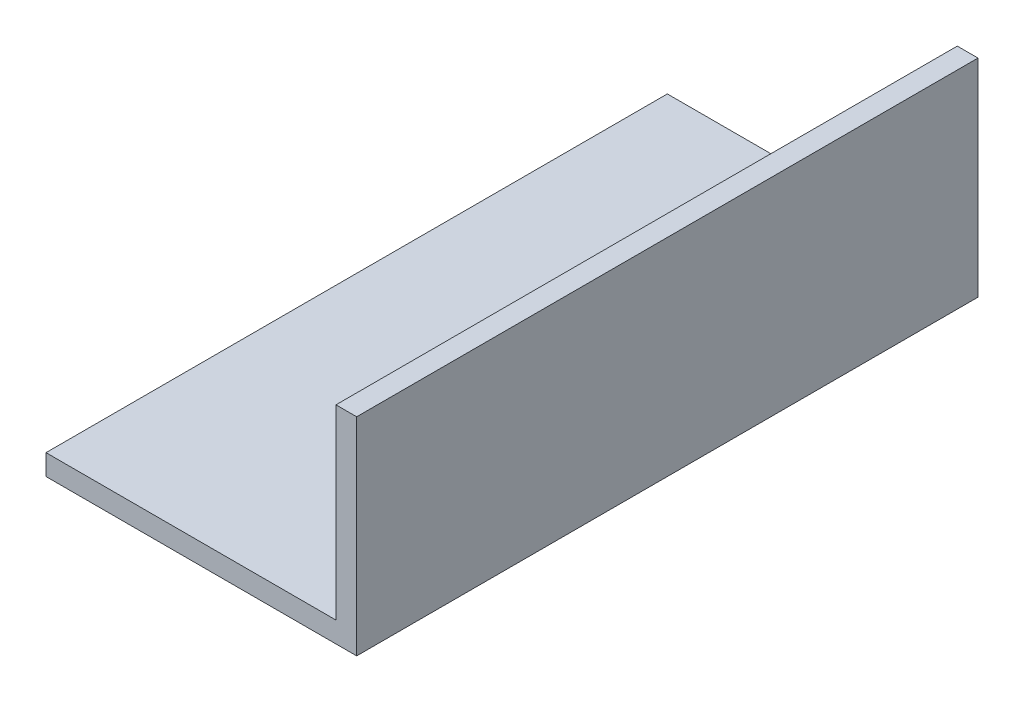
ISO-10303-21;
HEADER;
FILE_DESCRIPTION(('STEP AP214'),'2;1');
FILE_NAME('part.step','',(''),(''),'','','');
FILE_SCHEMA(('AUTOMOTIVE_DESIGN { 1 0 10303 214 1 1 1 1 }'));
ENDSEC;
DATA;
#1=APPLICATION_CONTEXT('core data for automotive mechanical design processes');
#2=APPLICATION_PROTOCOL_DEFINITION('international standard','automotive_design',2000,#1);
#3=PRODUCT_CONTEXT('',#1,'mechanical');
#4=PRODUCT('Part','Part','',(#3));
#5=PRODUCT_RELATED_PRODUCT_CATEGORY('part','',(#4));
#6=PRODUCT_DEFINITION_FORMATION('','',#4);
#7=PRODUCT_DEFINITION_CONTEXT('part definition',#1,'design');
#8=PRODUCT_DEFINITION('design','',#6,#7);
#9=PRODUCT_DEFINITION_SHAPE('','',#8);
#10=(LENGTH_UNIT() NAMED_UNIT(*) SI_UNIT(.MILLI.,.METRE.));
#11=(NAMED_UNIT(*) PLANE_ANGLE_UNIT() SI_UNIT($,.RADIAN.));
#12=(NAMED_UNIT(*) SI_UNIT($,.STERADIAN.) SOLID_ANGLE_UNIT());
#13=UNCERTAINTY_MEASURE_WITH_UNIT(LENGTH_MEASURE(1.E-05),#10,'distance_accuracy_value','');
#14=(GEOMETRIC_REPRESENTATION_CONTEXT(3) GLOBAL_UNCERTAINTY_ASSIGNED_CONTEXT((#13)) GLOBAL_UNIT_ASSIGNED_CONTEXT((#10,
#11,#12)) REPRESENTATION_CONTEXT('',''));
#15=CARTESIAN_POINT('',(0.,0.,0.));
#16=DIRECTION('',(0.,0.,1.));
#17=DIRECTION('',(1.,0.,0.));
#18=AXIS2_PLACEMENT_3D('',#15,#16,#17);
#19=CARTESIAN_POINT('',(19.05,12.7,38.1));
#20=DIRECTION('',(0.,-1.,0.));
#21=DIRECTION('',(0.,0.,-1.));
#22=AXIS2_PLACEMENT_3D('',#19,#20,#21);
#23=PLANE('',#22);
#24=DIRECTION('',(-1.,0.,0.));
#25=VECTOR('',#24,1.);
#26=CARTESIAN_POINT('',(19.05,12.7,-38.1));
#27=LINE('',#26,#25);
#28=CARTESIAN_POINT('',(19.05,12.7,-38.1));
#29=VERTEX_POINT('',#28);
#30=CARTESIAN_POINT('',(16.51,12.7,-38.1));
#31=VERTEX_POINT('',#30);
#32=EDGE_CURVE('E128',#29,#31,#27,.T.);
#33=ORIENTED_EDGE('',*,*,#32,.T.);
#34=DIRECTION('',(0.,0.,-1.));
#35=VECTOR('',#34,1.);
#36=CARTESIAN_POINT('',(16.51,12.7,38.1));
#37=LINE('',#36,#35);
#38=CARTESIAN_POINT('',(16.51,12.7,38.1));
#39=VERTEX_POINT('',#38);
#40=EDGE_CURVE('E11',#39,#31,#37,.T.);
#41=ORIENTED_EDGE('',*,*,#40,.F.);
#42=DIRECTION('',(-1.,0.,0.));
#43=VECTOR('',#42,1.);
#44=CARTESIAN_POINT('',(19.05,12.7,38.1));
#45=LINE('',#44,#43);
#46=CARTESIAN_POINT('',(19.05,12.7,38.1));
#47=VERTEX_POINT('',#46);
#48=EDGE_CURVE('E144',#47,#39,#45,.T.);
#49=ORIENTED_EDGE('',*,*,#48,.F.);
#50=DIRECTION('',(0.,0.,-1.));
#51=VECTOR('',#50,1.);
#52=CARTESIAN_POINT('',(19.05,12.7,38.1));
#53=LINE('',#52,#51);
#54=EDGE_CURVE('E124',#47,#29,#53,.T.);
#55=ORIENTED_EDGE('',*,*,#54,.T.);
#56=EDGE_LOOP('',(#33,#41,#49,#55));
#57=FACE_BOUND('',#56,.T.);
#58=ADVANCED_FACE('F39',(#57),#23,.F.);
#59=CARTESIAN_POINT('',(16.51,12.7,38.1));
#60=DIRECTION('',(1.,0.,0.));
#61=DIRECTION('',(0.,1.,0.));
#62=AXIS2_PLACEMENT_3D('',#59,#60,#61);
#63=PLANE('',#62);
#64=DIRECTION('',(0.,-1.,0.));
#65=VECTOR('',#64,1.);
#66=CARTESIAN_POINT('',(16.51,12.7,-38.1));
#67=LINE('',#66,#65);
#68=CARTESIAN_POINT('',(16.51,-10.16,-38.1));
#69=VERTEX_POINT('',#68);
#70=EDGE_CURVE('E132',#31,#69,#67,.T.);
#71=ORIENTED_EDGE('',*,*,#70,.T.);
#72=DIRECTION('',(0.,0.,-1.));
#73=VECTOR('',#72,1.);
#74=CARTESIAN_POINT('',(16.51,-10.16,38.1));
#75=LINE('',#74,#73);
#76=CARTESIAN_POINT('',(16.51,-10.16,38.1));
#77=VERTEX_POINT('',#76);
#78=EDGE_CURVE('E48',#77,#69,#75,.T.);
#79=ORIENTED_EDGE('',*,*,#78,.F.);
#80=DIRECTION('',(0.,-1.,0.));
#81=VECTOR('',#80,1.);
#82=CARTESIAN_POINT('',(16.51,12.7,38.1));
#83=LINE('',#82,#81);
#84=EDGE_CURVE('E93',#39,#77,#83,.T.);
#85=ORIENTED_EDGE('',*,*,#84,.F.);
#86=ORIENTED_EDGE('',*,*,#40,.T.);
#87=EDGE_LOOP('',(#71,#79,#85,#86));
#88=FACE_BOUND('',#87,.T.);
#89=ADVANCED_FACE('F172',(#88),#63,.F.);
#90=CARTESIAN_POINT('',(16.51,-10.16,38.1));
#91=DIRECTION('',(0.,-1.,0.));
#92=DIRECTION('',(1.,0.,0.));
#93=AXIS2_PLACEMENT_3D('',#90,#91,#92);
#94=PLANE('',#93);
#95=DIRECTION('',(-1.,0.,0.));
#96=VECTOR('',#95,1.);
#97=CARTESIAN_POINT('',(16.51,-10.16,-38.1));
#98=LINE('',#97,#96);
#99=CARTESIAN_POINT('',(-19.05,-10.16,-38.1));
#100=VERTEX_POINT('',#99);
#101=EDGE_CURVE('E135',#69,#100,#98,.T.);
#102=ORIENTED_EDGE('',*,*,#101,.T.);
#103=DIRECTION('',(0.,0.,-1.));
#104=VECTOR('',#103,1.);
#105=CARTESIAN_POINT('',(-19.05,-10.16,38.1));
#106=LINE('',#105,#104);
#107=CARTESIAN_POINT('',(-19.05,-10.16,38.1));
#108=VERTEX_POINT('',#107);
#109=EDGE_CURVE('E117',#108,#100,#106,.T.);
#110=ORIENTED_EDGE('',*,*,#109,.F.);
#111=DIRECTION('',(-1.,0.,0.));
#112=VECTOR('',#111,1.);
#113=CARTESIAN_POINT('',(16.51,-10.16,38.1));
#114=LINE('',#113,#112);
#115=EDGE_CURVE('E106',#77,#108,#114,.T.);
#116=ORIENTED_EDGE('',*,*,#115,.F.);
#117=ORIENTED_EDGE('',*,*,#78,.T.);
#118=EDGE_LOOP('',(#102,#110,#116,#117));
#119=FACE_BOUND('',#118,.T.);
#120=ADVANCED_FACE('F154',(#119),#94,.F.);
#121=CARTESIAN_POINT('',(-19.05,-10.16,38.1));
#122=DIRECTION('',(1.,0.,0.));
#123=DIRECTION('',(0.,0.,-1.));
#124=AXIS2_PLACEMENT_3D('',#121,#122,#123);
#125=PLANE('',#124);
#126=DIRECTION('',(0.,-1.,0.));
#127=VECTOR('',#126,1.);
#128=CARTESIAN_POINT('',(-19.05,-10.16,-38.1));
#129=LINE('',#128,#127);
#130=CARTESIAN_POINT('',(-19.05,-12.7,-38.1));
#131=VERTEX_POINT('',#130);
#132=EDGE_CURVE('E115',#100,#131,#129,.T.);
#133=ORIENTED_EDGE('',*,*,#132,.T.);
#134=DIRECTION('',(0.,0.,-1.));
#135=VECTOR('',#134,1.);
#136=CARTESIAN_POINT('',(-19.05,-12.7,38.1));
#137=LINE('',#136,#135);
#138=CARTESIAN_POINT('',(-19.05,-12.7,38.1));
#139=VERTEX_POINT('',#138);
#140=EDGE_CURVE('E112',#139,#131,#137,.T.);
#141=ORIENTED_EDGE('',*,*,#140,.F.);
#142=DIRECTION('',(0.,-1.,0.));
#143=VECTOR('',#142,1.);
#144=CARTESIAN_POINT('',(-19.05,-10.16,38.1));
#145=LINE('',#144,#143);
#146=EDGE_CURVE('E100',#108,#139,#145,.T.);
#147=ORIENTED_EDGE('',*,*,#146,.F.);
#148=ORIENTED_EDGE('',*,*,#109,.T.);
#149=EDGE_LOOP('',(#133,#141,#147,#148));
#150=FACE_BOUND('',#149,.T.);
#151=ADVANCED_FACE('F113',(#150),#125,.F.);
#152=CARTESIAN_POINT('',(-19.05,-12.7,38.1));
#153=DIRECTION('',(0.,1.,0.));
#154=DIRECTION('',(0.,0.,1.));
#155=AXIS2_PLACEMENT_3D('',#152,#153,#154);
#156=PLANE('',#155);
#157=DIRECTION('',(1.,0.,0.));
#158=VECTOR('',#157,1.);
#159=CARTESIAN_POINT('',(-19.05,-12.7,-38.1));
#160=LINE('',#159,#158);
#161=CARTESIAN_POINT('',(19.05,-12.7,-38.1));
#162=VERTEX_POINT('',#161);
#163=EDGE_CURVE('E79',#131,#162,#160,.T.);
#164=ORIENTED_EDGE('',*,*,#163,.T.);
#165=DIRECTION('',(0.,0.,-1.));
#166=VECTOR('',#165,1.);
#167=CARTESIAN_POINT('',(19.05,-12.7,38.1));
#168=LINE('',#167,#166);
#169=CARTESIAN_POINT('',(19.05,-12.7,38.1));
#170=VERTEX_POINT('',#169);
#171=EDGE_CURVE('E118',#170,#162,#168,.T.);
#172=ORIENTED_EDGE('',*,*,#171,.F.);
#173=DIRECTION('',(1.,0.,0.));
#174=VECTOR('',#173,1.);
#175=CARTESIAN_POINT('',(-19.05,-12.7,38.1));
#176=LINE('',#175,#174);
#177=EDGE_CURVE('E104',#139,#170,#176,.T.);
#178=ORIENTED_EDGE('',*,*,#177,.F.);
#179=ORIENTED_EDGE('',*,*,#140,.T.);
#180=EDGE_LOOP('',(#164,#172,#178,#179));
#181=FACE_BOUND('',#180,.T.);
#182=ADVANCED_FACE('F120',(#181),#156,.F.);
#183=CARTESIAN_POINT('',(19.05,-12.7,38.1));
#184=DIRECTION('',(-1.,0.,0.));
#185=DIRECTION('',(0.,0.,1.));
#186=AXIS2_PLACEMENT_3D('',#183,#184,#185);
#187=PLANE('',#186);
#188=DIRECTION('',(0.,1.,0.));
#189=VECTOR('',#188,1.);
#190=CARTESIAN_POINT('',(19.05,-12.7,-38.1));
#191=LINE('',#190,#189);
#192=EDGE_CURVE('E85',#162,#29,#191,.T.);
#193=ORIENTED_EDGE('',*,*,#192,.T.);
#194=ORIENTED_EDGE('',*,*,#54,.F.);
#195=DIRECTION('',(0.,1.,0.));
#196=VECTOR('',#195,1.);
#197=CARTESIAN_POINT('',(19.05,-12.7,38.1));
#198=LINE('',#197,#196);
#199=EDGE_CURVE('E56',#170,#47,#198,.T.);
#200=ORIENTED_EDGE('',*,*,#199,.F.);
#201=ORIENTED_EDGE('',*,*,#171,.T.);
#202=EDGE_LOOP('',(#193,#194,#200,#201));
#203=FACE_BOUND('',#202,.T.);
#204=ADVANCED_FACE('F161',(#203),#187,.F.);
#205=CARTESIAN_POINT('',(0.,0.,38.1));
#206=DIRECTION('',(0.,0.,1.));
#207=DIRECTION('',(1.,0.,0.));
#208=AXIS2_PLACEMENT_3D('',#205,#206,#207);
#209=PLANE('',#208);
#210=ORIENTED_EDGE('',*,*,#48,.T.);
#211=ORIENTED_EDGE('',*,*,#84,.T.);
#212=ORIENTED_EDGE('',*,*,#115,.T.);
#213=ORIENTED_EDGE('',*,*,#146,.T.);
#214=ORIENTED_EDGE('',*,*,#177,.T.);
#215=ORIENTED_EDGE('',*,*,#199,.T.);
#216=EDGE_LOOP('',(#210,#211,#212,#213,#214,#215));
#217=FACE_BOUND('',#216,.T.);
#218=ADVANCED_FACE('F102',(#217),#209,.T.);
#219=CARTESIAN_POINT('',(0.,0.,-38.1));
#220=DIRECTION('',(0.,0.,1.));
#221=DIRECTION('',(1.,0.,0.));
#222=AXIS2_PLACEMENT_3D('',#219,#220,#221);
#223=PLANE('',#222);
#224=ORIENTED_EDGE('',*,*,#32,.F.);
#225=ORIENTED_EDGE('',*,*,#192,.F.);
#226=ORIENTED_EDGE('',*,*,#163,.F.);
#227=ORIENTED_EDGE('',*,*,#132,.F.);
#228=ORIENTED_EDGE('',*,*,#101,.F.);
#229=ORIENTED_EDGE('',*,*,#70,.F.);
#230=EDGE_LOOP('',(#224,#225,#226,#227,#228,#229));
#231=FACE_BOUND('',#230,.T.);
#232=ADVANCED_FACE('F157',(#231),#223,.F.);
#233=CLOSED_SHELL('',(#58,#89,#120,#151,#182,#204,#218,#232));
#234=MANIFOLD_SOLID_BREP('B2',#233);
#235=ADVANCED_BREP_SHAPE_REPRESENTATION('',(#18,#234),#14);
#236=SHAPE_DEFINITION_REPRESENTATION(#9,#235);
ENDSEC;
END-ISO-10303-21;
